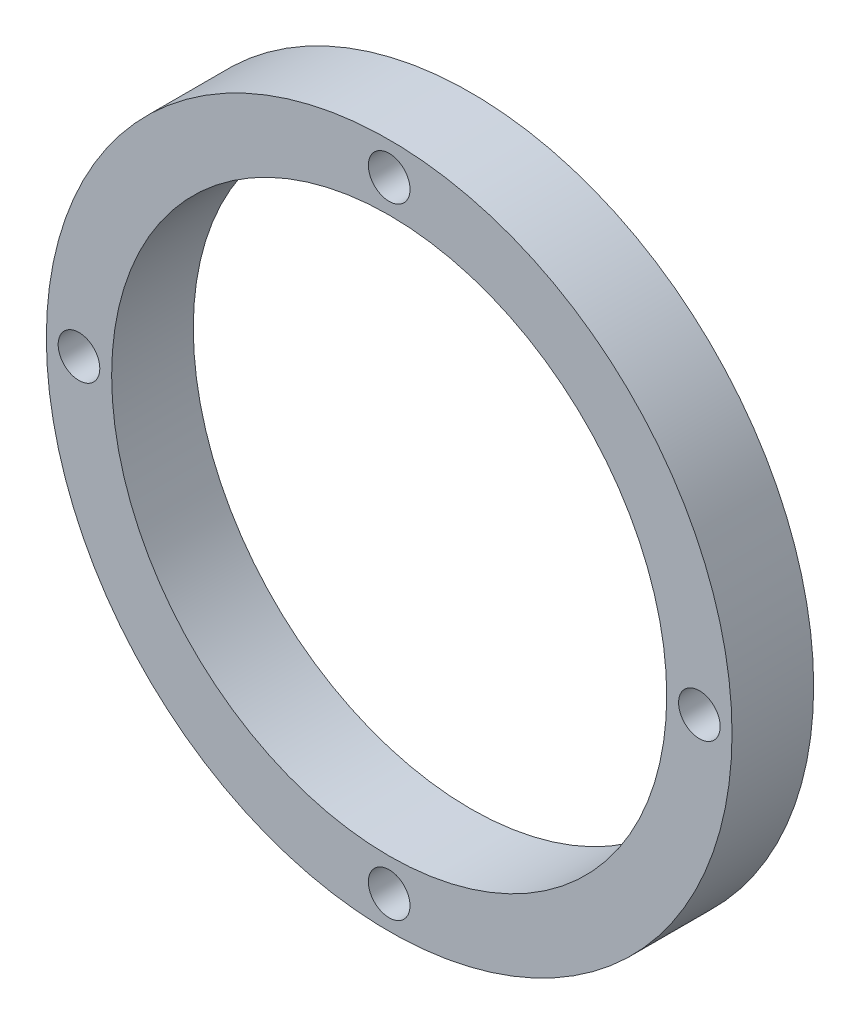
ISO-10303-21;
HEADER;
FILE_DESCRIPTION(('STEP AP214'),'2;1');
FILE_NAME('part.step','',(''),(''),'','','');
FILE_SCHEMA(('AUTOMOTIVE_DESIGN { 1 0 10303 214 1 1 1 1 }'));
ENDSEC;
DATA;
#1=APPLICATION_CONTEXT('core data for automotive mechanical design processes');
#2=APPLICATION_PROTOCOL_DEFINITION('international standard','automotive_design',2000,#1);
#3=PRODUCT_CONTEXT('',#1,'mechanical');
#4=PRODUCT('Part','Part','',(#3));
#5=PRODUCT_RELATED_PRODUCT_CATEGORY('part','',(#4));
#6=PRODUCT_DEFINITION_FORMATION('','',#4);
#7=PRODUCT_DEFINITION_CONTEXT('part definition',#1,'design');
#8=PRODUCT_DEFINITION('design','',#6,#7);
#9=PRODUCT_DEFINITION_SHAPE('','',#8);
#10=(LENGTH_UNIT() NAMED_UNIT(*) SI_UNIT(.MILLI.,.METRE.));
#11=(NAMED_UNIT(*) PLANE_ANGLE_UNIT() SI_UNIT($,.RADIAN.));
#12=(NAMED_UNIT(*) SI_UNIT($,.STERADIAN.) SOLID_ANGLE_UNIT());
#13=UNCERTAINTY_MEASURE_WITH_UNIT(LENGTH_MEASURE(1.E-05),#10,'distance_accuracy_value','');
#14=(GEOMETRIC_REPRESENTATION_CONTEXT(3) GLOBAL_UNCERTAINTY_ASSIGNED_CONTEXT((#13)) GLOBAL_UNIT_ASSIGNED_CONTEXT((#10,
#11,#12)) REPRESENTATION_CONTEXT('',''));
#15=CARTESIAN_POINT('',(0.,0.,0.));
#16=DIRECTION('',(0.,0.,1.));
#17=DIRECTION('',(1.,0.,0.));
#18=AXIS2_PLACEMENT_3D('',#15,#16,#17);
#19=CARTESIAN_POINT('',(0.,38.,10.));
#20=DIRECTION('',(0.,0.,-1.));
#21=DIRECTION('',(-1.,0.,0.));
#22=AXIS2_PLACEMENT_3D('',#19,#20,#21);
#23=CYLINDRICAL_SURFACE('',#22,1.75);
#24=CARTESIAN_POINT('',(0.,38.,0.));
#25=DIRECTION('',(0.,0.,1.));
#26=DIRECTION('',(1.,0.,0.));
#27=AXIS2_PLACEMENT_3D('',#24,#25,#26);
#28=CIRCLE('',#27,1.75);
#29=CARTESIAN_POINT('',(1.75,38.,0.));
#30=VERTEX_POINT('',#29);
#31=EDGE_CURVE('E81',#30,#30,#28,.T.);
#32=ORIENTED_EDGE('',*,*,#31,.F.);
#33=EDGE_LOOP('',(#32));
#34=FACE_BOUND('',#33,.T.);
#35=CARTESIAN_POINT('',(0.,38.,3.));
#36=DIRECTION('',(0.,0.,1.));
#37=DIRECTION('',(1.,0.,0.));
#38=AXIS2_PLACEMENT_3D('',#35,#36,#37);
#39=CIRCLE('',#38,1.75);
#40=CARTESIAN_POINT('',(1.75,38.,3.));
#41=VERTEX_POINT('',#40);
#42=EDGE_CURVE('E38',#41,#41,#39,.T.);
#43=ORIENTED_EDGE('',*,*,#42,.T.);
#44=EDGE_LOOP('',(#43));
#45=FACE_BOUND('',#44,.T.);
#46=ADVANCED_FACE('F34',(#34,#45),#23,.F.);
#47=CARTESIAN_POINT('',(38.0000000000011,1.07537130051859E-12,10.));
#48=DIRECTION('',(0.,0.,-1.));
#49=DIRECTION('',(-1.,0.,0.));
#50=AXIS2_PLACEMENT_3D('',#47,#48,#49);
#51=CYLINDRICAL_SURFACE('',#50,1.75000000000084);
#52=CARTESIAN_POINT('',(38.0000000000011,1.07537130051859E-12,0.));
#53=DIRECTION('',(0.,0.,1.));
#54=DIRECTION('',(1.,0.,0.));
#55=AXIS2_PLACEMENT_3D('',#52,#53,#54);
#56=CIRCLE('',#55,1.75000000000084);
#57=CARTESIAN_POINT('',(39.7500000000019,1.07537130051859E-12,0.));
#58=VERTEX_POINT('',#57);
#59=EDGE_CURVE('E73',#58,#58,#56,.T.);
#60=ORIENTED_EDGE('',*,*,#59,.F.);
#61=EDGE_LOOP('',(#60));
#62=FACE_BOUND('',#61,.T.);
#63=CARTESIAN_POINT('',(38.0000000000011,1.07537130051859E-12,3.));
#64=DIRECTION('',(0.,0.,1.));
#65=DIRECTION('',(1.,0.,0.));
#66=AXIS2_PLACEMENT_3D('',#63,#64,#65);
#67=CIRCLE('',#66,1.75000000000084);
#68=CARTESIAN_POINT('',(39.7500000000019,1.07537130051859E-12,3.));
#69=VERTEX_POINT('',#68);
#70=EDGE_CURVE('E59',#69,#69,#67,.T.);
#71=ORIENTED_EDGE('',*,*,#70,.T.);
#72=EDGE_LOOP('',(#71));
#73=FACE_BOUND('',#72,.T.);
#74=ADVANCED_FACE('F107',(#62,#73),#51,.F.);
#75=CARTESIAN_POINT('',(2.15230010754795E-12,-38.,10.));
#76=DIRECTION('',(0.,0.,-1.));
#77=DIRECTION('',(-1.,0.,0.));
#78=AXIS2_PLACEMENT_3D('',#75,#76,#77);
#79=CYLINDRICAL_SURFACE('',#78,1.75000000000231);
#80=CARTESIAN_POINT('',(2.15230010754795E-12,-38.,0.));
#81=DIRECTION('',(0.,0.,1.));
#82=DIRECTION('',(1.,0.,0.));
#83=AXIS2_PLACEMENT_3D('',#80,#81,#82);
#84=CIRCLE('',#83,1.75000000000231);
#85=CARTESIAN_POINT('',(1.75000000000447,-38.,0.));
#86=VERTEX_POINT('',#85);
#87=EDGE_CURVE('E68',#86,#86,#84,.T.);
#88=ORIENTED_EDGE('',*,*,#87,.F.);
#89=EDGE_LOOP('',(#88));
#90=FACE_BOUND('',#89,.T.);
#91=CARTESIAN_POINT('',(2.15230010754795E-12,-38.,3.));
#92=DIRECTION('',(0.,0.,1.));
#93=DIRECTION('',(1.,0.,0.));
#94=AXIS2_PLACEMENT_3D('',#91,#92,#93);
#95=CIRCLE('',#94,1.75000000000231);
#96=CARTESIAN_POINT('',(1.75000000000447,-38.,3.));
#97=VERTEX_POINT('',#96);
#98=EDGE_CURVE('E56',#97,#97,#95,.T.);
#99=ORIENTED_EDGE('',*,*,#98,.T.);
#100=EDGE_LOOP('',(#99));
#101=FACE_BOUND('',#100,.T.);
#102=ADVANCED_FACE('F112',(#90,#101),#79,.F.);
#103=CARTESIAN_POINT('',(-37.9999999999989,-1.08002495835535E-12,10.));
#104=DIRECTION('',(0.,0.,-1.));
#105=DIRECTION('',(-1.,0.,0.));
#106=AXIS2_PLACEMENT_3D('',#103,#104,#105);
#107=CYLINDRICAL_SURFACE('',#106,1.75000000000174);
#108=CARTESIAN_POINT('',(-37.9999999999989,-1.08002495835535E-12,0.));
#109=DIRECTION('',(0.,0.,1.));
#110=DIRECTION('',(1.,0.,0.));
#111=AXIS2_PLACEMENT_3D('',#108,#109,#110);
#112=CIRCLE('',#111,1.75000000000174);
#113=CARTESIAN_POINT('',(-36.2499999999972,-1.08002495835535E-12,0.));
#114=VERTEX_POINT('',#113);
#115=EDGE_CURVE('E64',#114,#114,#112,.T.);
#116=ORIENTED_EDGE('',*,*,#115,.F.);
#117=EDGE_LOOP('',(#116));
#118=FACE_BOUND('',#117,.T.);
#119=CARTESIAN_POINT('',(-37.9999999999989,-1.08002495835535E-12,3.));
#120=DIRECTION('',(0.,0.,1.));
#121=DIRECTION('',(1.,0.,0.));
#122=AXIS2_PLACEMENT_3D('',#119,#120,#121);
#123=CIRCLE('',#122,1.75000000000174);
#124=CARTESIAN_POINT('',(-36.2499999999972,-1.08002495835535E-12,3.));
#125=VERTEX_POINT('',#124);
#126=EDGE_CURVE('E53',#125,#125,#123,.T.);
#127=ORIENTED_EDGE('',*,*,#126,.T.);
#128=EDGE_LOOP('',(#127));
#129=FACE_BOUND('',#128,.T.);
#130=ADVANCED_FACE('F119',(#118,#129),#107,.F.);
#131=CARTESIAN_POINT('',(0.,0.,10.));
#132=DIRECTION('',(0.,0.,1.));
#133=DIRECTION('',(1.,0.,0.));
#134=AXIS2_PLACEMENT_3D('',#131,#132,#133);
#135=PLANE('',#134);
#136=CARTESIAN_POINT('',(0.,38.,10.));
#137=DIRECTION('',(0.,0.,1.));
#138=DIRECTION('',(1.,0.,0.));
#139=AXIS2_PLACEMENT_3D('',#136,#137,#138);
#140=CIRCLE('',#139,2.55);
#141=CARTESIAN_POINT('',(2.55,38.,10.));
#142=VERTEX_POINT('',#141);
#143=EDGE_CURVE('E156',#142,#142,#140,.T.);
#144=ORIENTED_EDGE('',*,*,#143,.F.);
#145=EDGE_LOOP('',(#144));
#146=FACE_BOUND('',#145,.T.);
#147=CARTESIAN_POINT('',(38.0000000000011,1.07537130051859E-12,10.));
#148=DIRECTION('',(0.,0.,1.));
#149=DIRECTION('',(1.,0.,0.));
#150=AXIS2_PLACEMENT_3D('',#147,#148,#149);
#151=CIRCLE('',#150,2.55000000000084);
#152=CARTESIAN_POINT('',(40.5500000000019,1.07537130051859E-12,10.));
#153=VERTEX_POINT('',#152);
#154=EDGE_CURVE('E164',#153,#153,#151,.T.);
#155=ORIENTED_EDGE('',*,*,#154,.F.);
#156=EDGE_LOOP('',(#155));
#157=FACE_BOUND('',#156,.T.);
#158=CARTESIAN_POINT('',(2.15230010754795E-12,-38.,10.));
#159=DIRECTION('',(0.,0.,1.));
#160=DIRECTION('',(1.,0.,0.));
#161=AXIS2_PLACEMENT_3D('',#158,#159,#160);
#162=CIRCLE('',#161,2.55000000000232);
#163=CARTESIAN_POINT('',(2.55000000000447,-38.,10.));
#164=VERTEX_POINT('',#163);
#165=EDGE_CURVE('E170',#164,#164,#162,.T.);
#166=ORIENTED_EDGE('',*,*,#165,.F.);
#167=EDGE_LOOP('',(#166));
#168=FACE_BOUND('',#167,.T.);
#169=CARTESIAN_POINT('',(-37.9999999999989,-1.08002495835535E-12,10.));
#170=DIRECTION('',(0.,0.,1.));
#171=DIRECTION('',(1.,0.,0.));
#172=AXIS2_PLACEMENT_3D('',#169,#170,#171);
#173=CIRCLE('',#172,2.55000000000174);
#174=CARTESIAN_POINT('',(-35.4499999999972,-1.08002495835535E-12,10.));
#175=VERTEX_POINT('',#174);
#176=EDGE_CURVE('E76',#175,#175,#173,.T.);
#177=ORIENTED_EDGE('',*,*,#176,.F.);
#178=EDGE_LOOP('',(#177));
#179=FACE_BOUND('',#178,.T.);
#180=CARTESIAN_POINT('',(0.,0.,10.));
#181=DIRECTION('',(0.,0.,1.));
#182=DIRECTION('',(1.,0.,0.));
#183=AXIS2_PLACEMENT_3D('',#180,#181,#182);
#184=CIRCLE('',#183,42.);
#185=CARTESIAN_POINT('',(42.,0.,10.));
#186=VERTEX_POINT('',#185);
#187=EDGE_CURVE('E10',#186,#186,#184,.T.);
#188=ORIENTED_EDGE('',*,*,#187,.T.);
#189=EDGE_LOOP('',(#188));
#190=FACE_BOUND('',#189,.T.);
#191=CARTESIAN_POINT('',(0.,0.,10.));
#192=DIRECTION('',(0.,0.,1.));
#193=DIRECTION('',(1.,0.,0.));
#194=AXIS2_PLACEMENT_3D('',#191,#192,#193);
#195=CIRCLE('',#194,34.);
#196=CARTESIAN_POINT('',(34.,0.,10.));
#197=VERTEX_POINT('',#196);
#198=EDGE_CURVE('E47',#197,#197,#195,.T.);
#199=ORIENTED_EDGE('',*,*,#198,.F.);
#200=EDGE_LOOP('',(#199));
#201=FACE_BOUND('',#200,.T.);
#202=ADVANCED_FACE('F122',(#146,#157,#168,#179,#190,#201),#135,.T.);
#203=CARTESIAN_POINT('',(0.,0.,0.));
#204=DIRECTION('',(0.,0.,1.));
#205=DIRECTION('',(1.,0.,0.));
#206=AXIS2_PLACEMENT_3D('',#203,#204,#205);
#207=PLANE('',#206);
#208=CARTESIAN_POINT('',(0.,0.,0.));
#209=DIRECTION('',(0.,0.,1.));
#210=DIRECTION('',(1.,0.,0.));
#211=AXIS2_PLACEMENT_3D('',#208,#209,#210);
#212=CIRCLE('',#211,42.);
#213=CARTESIAN_POINT('',(42.,0.,0.));
#214=VERTEX_POINT('',#213);
#215=EDGE_CURVE('E42',#214,#214,#212,.T.);
#216=ORIENTED_EDGE('',*,*,#215,.F.);
#217=EDGE_LOOP('',(#216));
#218=FACE_BOUND('',#217,.T.);
#219=CARTESIAN_POINT('',(0.,0.,0.));
#220=DIRECTION('',(0.,0.,1.));
#221=DIRECTION('',(1.,0.,0.));
#222=AXIS2_PLACEMENT_3D('',#219,#220,#221);
#223=CIRCLE('',#222,34.);
#224=CARTESIAN_POINT('',(34.,0.,0.));
#225=VERTEX_POINT('',#224);
#226=EDGE_CURVE('E50',#225,#225,#223,.T.);
#227=ORIENTED_EDGE('',*,*,#226,.T.);
#228=EDGE_LOOP('',(#227));
#229=FACE_BOUND('',#228,.T.);
#230=ORIENTED_EDGE('',*,*,#31,.T.);
#231=EDGE_LOOP('',(#230));
#232=FACE_BOUND('',#231,.T.);
#233=ORIENTED_EDGE('',*,*,#59,.T.);
#234=EDGE_LOOP('',(#233));
#235=FACE_BOUND('',#234,.T.);
#236=ORIENTED_EDGE('',*,*,#87,.T.);
#237=EDGE_LOOP('',(#236));
#238=FACE_BOUND('',#237,.T.);
#239=ORIENTED_EDGE('',*,*,#115,.T.);
#240=EDGE_LOOP('',(#239));
#241=FACE_BOUND('',#240,.T.);
#242=ADVANCED_FACE('F89',(#218,#229,#232,#235,#238,#241),#207,.F.);
#243=CARTESIAN_POINT('',(0.,0.,10.));
#244=DIRECTION('',(0.,0.,-1.));
#245=DIRECTION('',(-1.,0.,0.));
#246=AXIS2_PLACEMENT_3D('',#243,#244,#245);
#247=CYLINDRICAL_SURFACE('',#246,42.);
#248=ORIENTED_EDGE('',*,*,#187,.F.);
#249=EDGE_LOOP('',(#248));
#250=FACE_BOUND('',#249,.T.);
#251=ORIENTED_EDGE('',*,*,#215,.T.);
#252=EDGE_LOOP('',(#251));
#253=FACE_BOUND('',#252,.T.);
#254=ADVANCED_FACE('F36',(#250,#253),#247,.T.);
#255=CARTESIAN_POINT('',(0.,0.,10.));
#256=DIRECTION('',(0.,0.,-1.));
#257=DIRECTION('',(-1.,0.,0.));
#258=AXIS2_PLACEMENT_3D('',#255,#256,#257);
#259=CYLINDRICAL_SURFACE('',#258,34.);
#260=ORIENTED_EDGE('',*,*,#198,.T.);
#261=EDGE_LOOP('',(#260));
#262=FACE_BOUND('',#261,.T.);
#263=ORIENTED_EDGE('',*,*,#226,.F.);
#264=EDGE_LOOP('',(#263));
#265=FACE_BOUND('',#264,.T.);
#266=ADVANCED_FACE('F92',(#262,#265),#259,.F.);
#267=CARTESIAN_POINT('',(-37.9999999999989,-1.08002495835535E-12,3.));
#268=DIRECTION('',(0.,0.,1.));
#269=DIRECTION('',(1.,0.,0.));
#270=AXIS2_PLACEMENT_3D('',#267,#268,#269);
#271=CYLINDRICAL_SURFACE('',#270,2.55000000000174);
#272=CARTESIAN_POINT('',(-37.9999999999989,-1.08002495835535E-12,3.));
#273=DIRECTION('',(0.,0.,1.));
#274=DIRECTION('',(1.,0.,0.));
#275=AXIS2_PLACEMENT_3D('',#272,#273,#274);
#276=CIRCLE('',#275,2.55000000000174);
#277=CARTESIAN_POINT('',(-35.4499999999972,-1.08002495835535E-12,3.));
#278=VERTEX_POINT('',#277);
#279=EDGE_CURVE('E172',#278,#278,#276,.T.);
#280=ORIENTED_EDGE('',*,*,#279,.F.);
#281=EDGE_LOOP('',(#280));
#282=FACE_BOUND('',#281,.T.);
#283=ORIENTED_EDGE('',*,*,#176,.T.);
#284=EDGE_LOOP('',(#283));
#285=FACE_BOUND('',#284,.T.);
#286=ADVANCED_FACE('F94',(#282,#285),#271,.F.);
#287=CARTESIAN_POINT('',(-37.9999999999989,-1.08002495835535E-12,3.));
#288=DIRECTION('',(0.,0.,1.));
#289=DIRECTION('',(1.,0.,0.));
#290=AXIS2_PLACEMENT_3D('',#287,#288,#289);
#291=PLANE('',#290);
#292=ORIENTED_EDGE('',*,*,#126,.F.);
#293=EDGE_LOOP('',(#292));
#294=FACE_BOUND('',#293,.T.);
#295=ORIENTED_EDGE('',*,*,#279,.T.);
#296=EDGE_LOOP('',(#295));
#297=FACE_BOUND('',#296,.T.);
#298=ADVANCED_FACE('F100',(#294,#297),#291,.T.);
#299=CARTESIAN_POINT('',(2.15230010754795E-12,-38.,3.));
#300=DIRECTION('',(0.,0.,1.));
#301=DIRECTION('',(1.,0.,0.));
#302=AXIS2_PLACEMENT_3D('',#299,#300,#301);
#303=CYLINDRICAL_SURFACE('',#302,2.55000000000232);
#304=CARTESIAN_POINT('',(2.15230010754795E-12,-38.,3.));
#305=DIRECTION('',(0.,0.,1.));
#306=DIRECTION('',(1.,0.,0.));
#307=AXIS2_PLACEMENT_3D('',#304,#305,#306);
#308=CIRCLE('',#307,2.55000000000232);
#309=CARTESIAN_POINT('',(2.55000000000447,-38.,3.));
#310=VERTEX_POINT('',#309);
#311=EDGE_CURVE('E167',#310,#310,#308,.T.);
#312=ORIENTED_EDGE('',*,*,#311,.F.);
#313=EDGE_LOOP('',(#312));
#314=FACE_BOUND('',#313,.T.);
#315=ORIENTED_EDGE('',*,*,#165,.T.);
#316=EDGE_LOOP('',(#315));
#317=FACE_BOUND('',#316,.T.);
#318=ADVANCED_FACE('F127',(#314,#317),#303,.F.);
#319=CARTESIAN_POINT('',(2.15230010754795E-12,-38.,3.));
#320=DIRECTION('',(0.,0.,1.));
#321=DIRECTION('',(1.,0.,0.));
#322=AXIS2_PLACEMENT_3D('',#319,#320,#321);
#323=PLANE('',#322);
#324=ORIENTED_EDGE('',*,*,#98,.F.);
#325=EDGE_LOOP('',(#324));
#326=FACE_BOUND('',#325,.T.);
#327=ORIENTED_EDGE('',*,*,#311,.T.);
#328=EDGE_LOOP('',(#327));
#329=FACE_BOUND('',#328,.T.);
#330=ADVANCED_FACE('F131',(#326,#329),#323,.T.);
#331=CARTESIAN_POINT('',(38.0000000000011,1.07537130051859E-12,3.));
#332=DIRECTION('',(0.,0.,1.));
#333=DIRECTION('',(1.,0.,0.));
#334=AXIS2_PLACEMENT_3D('',#331,#332,#333);
#335=CYLINDRICAL_SURFACE('',#334,2.55000000000084);
#336=CARTESIAN_POINT('',(38.0000000000011,1.07537130051859E-12,3.));
#337=DIRECTION('',(0.,0.,1.));
#338=DIRECTION('',(1.,0.,0.));
#339=AXIS2_PLACEMENT_3D('',#336,#337,#338);
#340=CIRCLE('',#339,2.55000000000084);
#341=CARTESIAN_POINT('',(40.5500000000019,1.07537130051859E-12,3.));
#342=VERTEX_POINT('',#341);
#343=EDGE_CURVE('E159',#342,#342,#340,.T.);
#344=ORIENTED_EDGE('',*,*,#343,.F.);
#345=EDGE_LOOP('',(#344));
#346=FACE_BOUND('',#345,.T.);
#347=ORIENTED_EDGE('',*,*,#154,.T.);
#348=EDGE_LOOP('',(#347));
#349=FACE_BOUND('',#348,.T.);
#350=ADVANCED_FACE('F135',(#346,#349),#335,.F.);
#351=CARTESIAN_POINT('',(38.0000000000011,1.07537130051859E-12,3.));
#352=DIRECTION('',(0.,0.,1.));
#353=DIRECTION('',(1.,0.,0.));
#354=AXIS2_PLACEMENT_3D('',#351,#352,#353);
#355=PLANE('',#354);
#356=ORIENTED_EDGE('',*,*,#70,.F.);
#357=EDGE_LOOP('',(#356));
#358=FACE_BOUND('',#357,.T.);
#359=ORIENTED_EDGE('',*,*,#343,.T.);
#360=EDGE_LOOP('',(#359));
#361=FACE_BOUND('',#360,.T.);
#362=ADVANCED_FACE('F139',(#358,#361),#355,.T.);
#363=CARTESIAN_POINT('',(0.,38.,3.));
#364=DIRECTION('',(0.,0.,1.));
#365=DIRECTION('',(1.,0.,0.));
#366=AXIS2_PLACEMENT_3D('',#363,#364,#365);
#367=CYLINDRICAL_SURFACE('',#366,2.55);
#368=CARTESIAN_POINT('',(0.,38.,3.));
#369=DIRECTION('',(0.,0.,1.));
#370=DIRECTION('',(1.,0.,0.));
#371=AXIS2_PLACEMENT_3D('',#368,#369,#370);
#372=CIRCLE('',#371,2.55);
#373=CARTESIAN_POINT('',(2.55,38.,3.));
#374=VERTEX_POINT('',#373);
#375=EDGE_CURVE('E57',#374,#374,#372,.T.);
#376=ORIENTED_EDGE('',*,*,#375,.F.);
#377=EDGE_LOOP('',(#376));
#378=FACE_BOUND('',#377,.T.);
#379=ORIENTED_EDGE('',*,*,#143,.T.);
#380=EDGE_LOOP('',(#379));
#381=FACE_BOUND('',#380,.T.);
#382=ADVANCED_FACE('F143',(#378,#381),#367,.F.);
#383=CARTESIAN_POINT('',(0.,38.,3.));
#384=DIRECTION('',(0.,0.,1.));
#385=DIRECTION('',(1.,0.,0.));
#386=AXIS2_PLACEMENT_3D('',#383,#384,#385);
#387=PLANE('',#386);
#388=ORIENTED_EDGE('',*,*,#42,.F.);
#389=EDGE_LOOP('',(#388));
#390=FACE_BOUND('',#389,.T.);
#391=ORIENTED_EDGE('',*,*,#375,.T.);
#392=EDGE_LOOP('',(#391));
#393=FACE_BOUND('',#392,.T.);
#394=ADVANCED_FACE('F147',(#390,#393),#387,.T.);
#395=CLOSED_SHELL('',(#46,#74,#102,#130,#202,#242,#254,#266,#286,#298,#318,#330,#350,#362,#382,#394));
#396=MANIFOLD_SOLID_BREP('B2',#395);
#397=ADVANCED_BREP_SHAPE_REPRESENTATION('',(#18,#396),#14);
#398=SHAPE_DEFINITION_REPRESENTATION(#9,#397);
ENDSEC;
END-ISO-10303-21;
